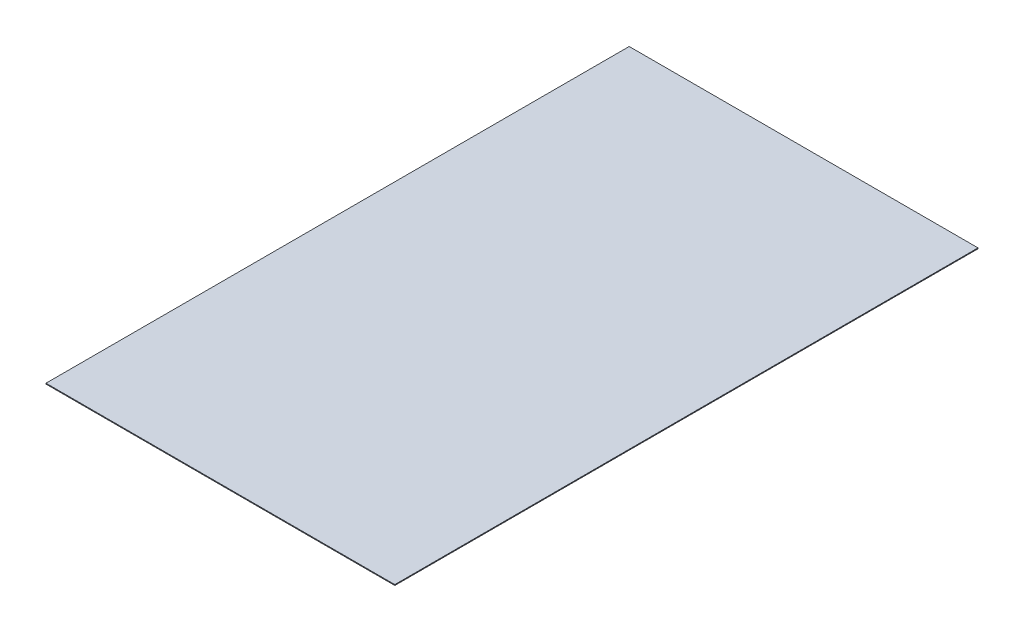
ISO-10303-21;
HEADER;
FILE_DESCRIPTION(('STEP AP214'),'2;1');
FILE_NAME('part.step','',(''),(''),'','','');
FILE_SCHEMA(('AUTOMOTIVE_DESIGN { 1 0 10303 214 1 1 1 1 }'));
ENDSEC;
DATA;
#1=APPLICATION_CONTEXT('core data for automotive mechanical design processes');
#2=APPLICATION_PROTOCOL_DEFINITION('international standard','automotive_design',2000,#1);
#3=PRODUCT_CONTEXT('',#1,'mechanical');
#4=PRODUCT('Part','Part','',(#3));
#5=PRODUCT_RELATED_PRODUCT_CATEGORY('part','',(#4));
#6=PRODUCT_DEFINITION_FORMATION('','',#4);
#7=PRODUCT_DEFINITION_CONTEXT('part definition',#1,'design');
#8=PRODUCT_DEFINITION('design','',#6,#7);
#9=PRODUCT_DEFINITION_SHAPE('','',#8);
#10=(LENGTH_UNIT() NAMED_UNIT(*) SI_UNIT(.MILLI.,.METRE.));
#11=(NAMED_UNIT(*) PLANE_ANGLE_UNIT() SI_UNIT($,.RADIAN.));
#12=(NAMED_UNIT(*) SI_UNIT($,.STERADIAN.) SOLID_ANGLE_UNIT());
#13=UNCERTAINTY_MEASURE_WITH_UNIT(LENGTH_MEASURE(1.E-05),#10,'distance_accuracy_value','');
#14=(GEOMETRIC_REPRESENTATION_CONTEXT(3) GLOBAL_UNCERTAINTY_ASSIGNED_CONTEXT((#13)) GLOBAL_UNIT_ASSIGNED_CONTEXT((#10,
#11,#12)) REPRESENTATION_CONTEXT('',''));
#15=CARTESIAN_POINT('',(0.,0.,0.));
#16=DIRECTION('',(0.,0.,1.));
#17=DIRECTION('',(1.,0.,0.));
#18=AXIS2_PLACEMENT_3D('',#15,#16,#17);
#19=CARTESIAN_POINT('',(0.,3.,0.));
#20=DIRECTION('',(1.,0.,0.));
#21=DIRECTION('',(0.,0.,-1.));
#22=AXIS2_PLACEMENT_3D('',#19,#20,#21);
#23=PLANE('',#22);
#24=DIRECTION('',(0.,0.,1.));
#25=VECTOR('',#24,1.);
#26=CARTESIAN_POINT('',(0.,0.,0.));
#27=LINE('',#26,#25);
#28=CARTESIAN_POINT('',(0.,0.,-2130.));
#29=VERTEX_POINT('',#28);
#30=CARTESIAN_POINT('',(0.,0.,0.));
#31=VERTEX_POINT('',#30);
#32=EDGE_CURVE('E101',#29,#31,#27,.T.);
#33=ORIENTED_EDGE('',*,*,#32,.T.);
#34=DIRECTION('',(0.,-1.,0.));
#35=VECTOR('',#34,1.);
#36=CARTESIAN_POINT('',(0.,3.,0.));
#37=LINE('',#36,#35);
#38=CARTESIAN_POINT('',(0.,3.,0.));
#39=VERTEX_POINT('',#38);
#40=EDGE_CURVE('E11',#39,#31,#37,.T.);
#41=ORIENTED_EDGE('',*,*,#40,.F.);
#42=DIRECTION('',(0.,0.,1.));
#43=VECTOR('',#42,1.);
#44=CARTESIAN_POINT('',(0.,3.,0.));
#45=LINE('',#44,#43);
#46=CARTESIAN_POINT('',(0.,3.,-2130.));
#47=VERTEX_POINT('',#46);
#48=EDGE_CURVE('E89',#47,#39,#45,.T.);
#49=ORIENTED_EDGE('',*,*,#48,.F.);
#50=DIRECTION('',(0.,-1.,0.));
#51=VECTOR('',#50,1.);
#52=CARTESIAN_POINT('',(0.,3.,-2130.));
#53=LINE('',#52,#51);
#54=EDGE_CURVE('E97',#47,#29,#53,.T.);
#55=ORIENTED_EDGE('',*,*,#54,.T.);
#56=EDGE_LOOP('',(#33,#41,#49,#55));
#57=FACE_BOUND('',#56,.T.);
#58=ADVANCED_FACE('F38',(#57),#23,.F.);
#59=CARTESIAN_POINT('',(0.,3.,0.));
#60=DIRECTION('',(0.,0.,-1.));
#61=DIRECTION('',(-1.,0.,0.));
#62=AXIS2_PLACEMENT_3D('',#59,#60,#61);
#63=PLANE('',#62);
#64=DIRECTION('',(1.,0.,0.));
#65=VECTOR('',#64,1.);
#66=CARTESIAN_POINT('',(0.,0.,0.));
#67=LINE('',#66,#65);
#68=CARTESIAN_POINT('',(1274.,0.,0.));
#69=VERTEX_POINT('',#68);
#70=EDGE_CURVE('E93',#31,#69,#67,.T.);
#71=ORIENTED_EDGE('',*,*,#70,.T.);
#72=DIRECTION('',(0.,-1.,0.));
#73=VECTOR('',#72,1.);
#74=CARTESIAN_POINT('',(1274.,3.,0.));
#75=LINE('',#74,#73);
#76=CARTESIAN_POINT('',(1274.,3.,0.));
#77=VERTEX_POINT('',#76);
#78=EDGE_CURVE('E46',#77,#69,#75,.T.);
#79=ORIENTED_EDGE('',*,*,#78,.F.);
#80=DIRECTION('',(1.,0.,0.));
#81=VECTOR('',#80,1.);
#82=CARTESIAN_POINT('',(0.,3.,0.));
#83=LINE('',#82,#81);
#84=EDGE_CURVE('E84',#39,#77,#83,.T.);
#85=ORIENTED_EDGE('',*,*,#84,.F.);
#86=ORIENTED_EDGE('',*,*,#40,.T.);
#87=EDGE_LOOP('',(#71,#79,#85,#86));
#88=FACE_BOUND('',#87,.T.);
#89=ADVANCED_FACE('F92',(#88),#63,.F.);
#90=CARTESIAN_POINT('',(1274.,3.,0.));
#91=DIRECTION('',(-1.,0.,0.));
#92=DIRECTION('',(0.,0.,1.));
#93=AXIS2_PLACEMENT_3D('',#90,#91,#92);
#94=PLANE('',#93);
#95=DIRECTION('',(0.,0.,-1.));
#96=VECTOR('',#95,1.);
#97=CARTESIAN_POINT('',(1274.,0.,0.));
#98=LINE('',#97,#96);
#99=CARTESIAN_POINT('',(1274.,0.,-2130.));
#100=VERTEX_POINT('',#99);
#101=EDGE_CURVE('E71',#69,#100,#98,.T.);
#102=ORIENTED_EDGE('',*,*,#101,.T.);
#103=DIRECTION('',(0.,-1.,0.));
#104=VECTOR('',#103,1.);
#105=CARTESIAN_POINT('',(1274.,3.,-2130.));
#106=LINE('',#105,#104);
#107=CARTESIAN_POINT('',(1274.,3.,-2130.));
#108=VERTEX_POINT('',#107);
#109=EDGE_CURVE('E94',#108,#100,#106,.T.);
#110=ORIENTED_EDGE('',*,*,#109,.F.);
#111=DIRECTION('',(0.,0.,-1.));
#112=VECTOR('',#111,1.);
#113=CARTESIAN_POINT('',(1274.,3.,0.));
#114=LINE('',#113,#112);
#115=EDGE_CURVE('E87',#77,#108,#114,.T.);
#116=ORIENTED_EDGE('',*,*,#115,.F.);
#117=ORIENTED_EDGE('',*,*,#78,.T.);
#118=EDGE_LOOP('',(#102,#110,#116,#117));
#119=FACE_BOUND('',#118,.T.);
#120=ADVANCED_FACE('F95',(#119),#94,.F.);
#121=CARTESIAN_POINT('',(0.,3.,-2130.));
#122=DIRECTION('',(0.,0.,1.));
#123=DIRECTION('',(1.,0.,0.));
#124=AXIS2_PLACEMENT_3D('',#121,#122,#123);
#125=PLANE('',#124);
#126=DIRECTION('',(-1.,0.,0.));
#127=VECTOR('',#126,1.);
#128=CARTESIAN_POINT('',(0.,0.,-2130.));
#129=LINE('',#128,#127);
#130=EDGE_CURVE('E77',#100,#29,#129,.T.);
#131=ORIENTED_EDGE('',*,*,#130,.T.);
#132=ORIENTED_EDGE('',*,*,#54,.F.);
#133=DIRECTION('',(-1.,0.,0.));
#134=VECTOR('',#133,1.);
#135=CARTESIAN_POINT('',(0.,3.,-2130.));
#136=LINE('',#135,#134);
#137=EDGE_CURVE('E54',#108,#47,#136,.T.);
#138=ORIENTED_EDGE('',*,*,#137,.F.);
#139=ORIENTED_EDGE('',*,*,#109,.T.);
#140=EDGE_LOOP('',(#131,#132,#138,#139));
#141=FACE_BOUND('',#140,.T.);
#142=ADVANCED_FACE('F108',(#141),#125,.F.);
#143=CARTESIAN_POINT('',(0.,3.,0.));
#144=DIRECTION('',(0.,-1.,0.));
#145=DIRECTION('',(0.,0.,-1.));
#146=AXIS2_PLACEMENT_3D('',#143,#144,#145);
#147=PLANE('',#146);
#148=ORIENTED_EDGE('',*,*,#48,.T.);
#149=ORIENTED_EDGE('',*,*,#84,.T.);
#150=ORIENTED_EDGE('',*,*,#115,.T.);
#151=ORIENTED_EDGE('',*,*,#137,.T.);
#152=EDGE_LOOP('',(#148,#149,#150,#151));
#153=FACE_BOUND('',#152,.T.);
#154=ADVANCED_FACE('F85',(#153),#147,.F.);
#155=CARTESIAN_POINT('',(0.,0.,0.));
#156=DIRECTION('',(0.,-1.,0.));
#157=DIRECTION('',(0.,0.,-1.));
#158=AXIS2_PLACEMENT_3D('',#155,#156,#157);
#159=PLANE('',#158);
#160=ORIENTED_EDGE('',*,*,#32,.F.);
#161=ORIENTED_EDGE('',*,*,#130,.F.);
#162=ORIENTED_EDGE('',*,*,#101,.F.);
#163=ORIENTED_EDGE('',*,*,#70,.F.);
#164=EDGE_LOOP('',(#160,#161,#162,#163));
#165=FACE_BOUND('',#164,.T.);
#166=ADVANCED_FACE('F111',(#165),#159,.T.);
#167=CLOSED_SHELL('',(#58,#89,#120,#142,#154,#166));
#168=MANIFOLD_SOLID_BREP('B2',#167);
#169=ADVANCED_BREP_SHAPE_REPRESENTATION('',(#18,#168),#14);
#170=SHAPE_DEFINITION_REPRESENTATION(#9,#169);
ENDSEC;
END-ISO-10303-21;
